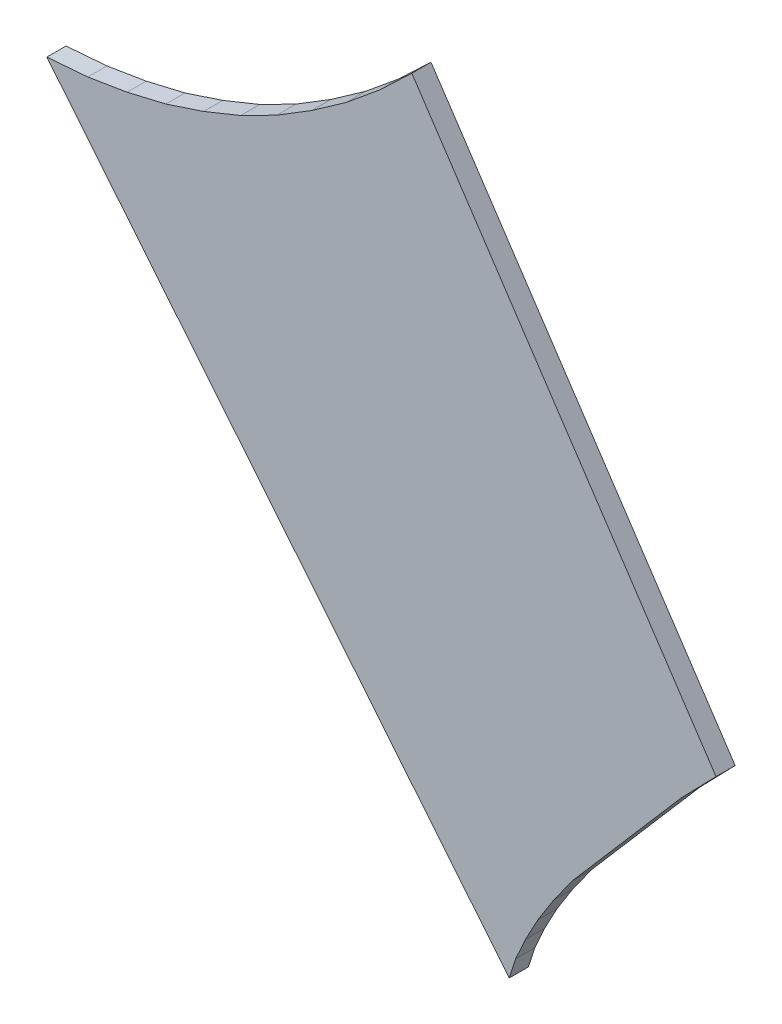
ISO-10303-21;
HEADER;
FILE_DESCRIPTION(('STEP AP214'),'2;1');
FILE_NAME('part.step','',(''),(''),'','','');
FILE_SCHEMA(('AUTOMOTIVE_DESIGN { 1 0 10303 214 1 1 1 1 }'));
ENDSEC;
DATA;
#1=APPLICATION_CONTEXT('core data for automotive mechanical design processes');
#2=APPLICATION_PROTOCOL_DEFINITION('international standard','automotive_design',2000,#1);
#3=PRODUCT_CONTEXT('',#1,'mechanical');
#4=PRODUCT('Part','Part','',(#3));
#5=PRODUCT_RELATED_PRODUCT_CATEGORY('part','',(#4));
#6=PRODUCT_DEFINITION_FORMATION('','',#4);
#7=PRODUCT_DEFINITION_CONTEXT('part definition',#1,'design');
#8=PRODUCT_DEFINITION('design','',#6,#7);
#9=PRODUCT_DEFINITION_SHAPE('','',#8);
#10=(LENGTH_UNIT() NAMED_UNIT(*) SI_UNIT(.MILLI.,.METRE.));
#11=(NAMED_UNIT(*) PLANE_ANGLE_UNIT() SI_UNIT($,.RADIAN.));
#12=(NAMED_UNIT(*) SI_UNIT($,.STERADIAN.) SOLID_ANGLE_UNIT());
#13=UNCERTAINTY_MEASURE_WITH_UNIT(LENGTH_MEASURE(1.E-05),#10,'distance_accuracy_value','');
#14=(GEOMETRIC_REPRESENTATION_CONTEXT(3) GLOBAL_UNCERTAINTY_ASSIGNED_CONTEXT((#13)) GLOBAL_UNIT_ASSIGNED_CONTEXT((#10,
#11,#12)) REPRESENTATION_CONTEXT('',''));
#15=CARTESIAN_POINT('',(0.,0.,0.));
#16=DIRECTION('',(0.,0.,1.));
#17=DIRECTION('',(1.,0.,0.));
#18=AXIS2_PLACEMENT_3D('',#15,#16,#17);
#19=CARTESIAN_POINT('',(80.5439987182617,81.3219985961914,0.));
#20=DIRECTION('',(0.688759153419594,-0.724990226541519,0.));
#21=DIRECTION('',(-0.724990226541519,-0.688759153419594,0.));
#22=AXIS2_PLACEMENT_3D('',#19,#20,#21);
#23=PLANE('',#22);
#24=DIRECTION('',(-0.724990226541519,-0.688759153419594,0.));
#25=VECTOR('',#24,1.);
#26=CARTESIAN_POINT('',(80.5439987182617,81.3219985961914,0.03556));
#27=LINE('',#26,#25);
#28=CARTESIAN_POINT('',(80.5439987182617,81.3219985961914,0.03556));
#29=VERTEX_POINT('',#28);
#30=CARTESIAN_POINT('',(80.484001159668,81.2649993896484,0.03556));
#31=VERTEX_POINT('',#30);
#32=EDGE_CURVE('E11',#29,#31,#27,.T.);
#33=ORIENTED_EDGE('',*,*,#32,.F.);
#34=DIRECTION('',(0.,0.,1.));
#35=VECTOR('',#34,1.);
#36=CARTESIAN_POINT('',(80.5439987182617,81.3219985961914,0.));
#37=LINE('',#36,#35);
#38=CARTESIAN_POINT('',(80.5439987182617,81.3219985961914,0.));
#39=VERTEX_POINT('',#38);
#40=EDGE_CURVE('E24',#39,#29,#37,.T.);
#41=ORIENTED_EDGE('',*,*,#40,.F.);
#42=DIRECTION('',(-0.724990226541519,-0.688759153419594,0.));
#43=VECTOR('',#42,1.);
#44=CARTESIAN_POINT('',(80.5439987182617,81.3219985961914,0.));
#45=LINE('',#44,#43);
#46=CARTESIAN_POINT('',(80.484001159668,81.2649993896484,0.));
#47=VERTEX_POINT('',#46);
#48=EDGE_CURVE('E166',#39,#47,#45,.T.);
#49=ORIENTED_EDGE('',*,*,#48,.T.);
#50=DIRECTION('',(0.,0.,1.));
#51=VECTOR('',#50,1.);
#52=CARTESIAN_POINT('',(80.484001159668,81.2649993896484,0.));
#53=LINE('',#52,#51);
#54=EDGE_CURVE('E37',#47,#31,#53,.T.);
#55=ORIENTED_EDGE('',*,*,#54,.T.);
#56=EDGE_LOOP('',(#33,#41,#49,#55));
#57=FACE_BOUND('',#56,.T.);
#58=ADVANCED_FACE('F17',(#57),#23,.F.);
#59=CARTESIAN_POINT('',(80.484001159668,81.2649993896484,0.));
#60=DIRECTION('',(0.635264139986217,-0.772294938768585,0.));
#61=DIRECTION('',(-0.772294938768585,-0.635264139986217,0.));
#62=AXIS2_PLACEMENT_3D('',#59,#60,#61);
#63=PLANE('',#62);
#64=DIRECTION('',(-0.772294938768585,-0.635264139986217,0.));
#65=VECTOR('',#64,1.);
#66=CARTESIAN_POINT('',(80.484001159668,81.2649993896484,0.03556));
#67=LINE('',#66,#65);
#68=CARTESIAN_POINT('',(80.4219970703125,81.213996887207,0.03556));
#69=VERTEX_POINT('',#68);
#70=EDGE_CURVE('E294',#31,#69,#67,.T.);
#71=ORIENTED_EDGE('',*,*,#70,.F.);
#72=ORIENTED_EDGE('',*,*,#54,.F.);
#73=DIRECTION('',(-0.772294938768585,-0.635264139986217,0.));
#74=VECTOR('',#73,1.);
#75=CARTESIAN_POINT('',(80.484001159668,81.2649993896484,0.));
#76=LINE('',#75,#74);
#77=CARTESIAN_POINT('',(80.4219970703125,81.213996887207,0.));
#78=VERTEX_POINT('',#77);
#79=EDGE_CURVE('E291',#47,#78,#76,.T.);
#80=ORIENTED_EDGE('',*,*,#79,.T.);
#81=DIRECTION('',(0.,0.,1.));
#82=VECTOR('',#81,1.);
#83=CARTESIAN_POINT('',(80.4219970703125,81.213996887207,0.));
#84=LINE('',#83,#82);
#85=EDGE_CURVE('E289',#78,#69,#84,.T.);
#86=ORIENTED_EDGE('',*,*,#85,.T.);
#87=EDGE_LOOP('',(#71,#72,#80,#86));
#88=FACE_BOUND('',#87,.T.);
#89=ADVANCED_FACE('F302',(#88),#63,.F.);
#90=CARTESIAN_POINT('',(80.4219970703125,81.213996887207,0.));
#91=DIRECTION('',(0.575188988071486,-0.818020554754769,0.));
#92=DIRECTION('',(-0.818020554754769,-0.575188988071486,0.));
#93=AXIS2_PLACEMENT_3D('',#90,#91,#92);
#94=PLANE('',#93);
#95=DIRECTION('',(-0.818020554754769,-0.575188988071486,0.));
#96=VECTOR('',#95,1.);
#97=CARTESIAN_POINT('',(80.4219970703125,81.213996887207,0.03556));
#98=LINE('',#97,#96);
#99=CARTESIAN_POINT('',(80.3580017089844,81.1689987182617,0.03556));
#100=VERTEX_POINT('',#99);
#101=EDGE_CURVE('E286',#69,#100,#98,.T.);
#102=ORIENTED_EDGE('',*,*,#101,.F.);
#103=ORIENTED_EDGE('',*,*,#85,.F.);
#104=DIRECTION('',(-0.818020554754769,-0.575188988071486,0.));
#105=VECTOR('',#104,1.);
#106=CARTESIAN_POINT('',(80.4219970703125,81.213996887207,0.));
#107=LINE('',#106,#105);
#108=CARTESIAN_POINT('',(80.3580017089844,81.1689987182617,0.));
#109=VERTEX_POINT('',#108);
#110=EDGE_CURVE('E283',#78,#109,#107,.T.);
#111=ORIENTED_EDGE('',*,*,#110,.T.);
#112=DIRECTION('',(0.,0.,1.));
#113=VECTOR('',#112,1.);
#114=CARTESIAN_POINT('',(80.3580017089844,81.1689987182617,0.));
#115=LINE('',#114,#113);
#116=EDGE_CURVE('E281',#109,#100,#115,.T.);
#117=ORIENTED_EDGE('',*,*,#116,.T.);
#118=EDGE_LOOP('',(#102,#103,#111,#117));
#119=FACE_BOUND('',#118,.T.);
#120=ADVANCED_FACE('F308',(#119),#94,.F.);
#121=CARTESIAN_POINT('',(80.3580017089844,81.1689987182617,0.));
#122=DIRECTION('',(0.524091848469024,-0.851661748799558,0.));
#123=DIRECTION('',(-0.851661748799558,-0.524091848469024,0.));
#124=AXIS2_PLACEMENT_3D('',#121,#122,#123);
#125=PLANE('',#124);
#126=DIRECTION('',(-0.851661748799558,-0.524091848469024,0.));
#127=VECTOR('',#126,1.);
#128=CARTESIAN_POINT('',(80.3580017089844,81.1689987182617,0.03556));
#129=LINE('',#128,#127);
#130=CARTESIAN_POINT('',(80.2929992675781,81.1289978027344,0.03556));
#131=VERTEX_POINT('',#130);
#132=EDGE_CURVE('E278',#100,#131,#129,.T.);
#133=ORIENTED_EDGE('',*,*,#132,.F.);
#134=ORIENTED_EDGE('',*,*,#116,.F.);
#135=DIRECTION('',(-0.851661748799558,-0.524091848469024,0.));
#136=VECTOR('',#135,1.);
#137=CARTESIAN_POINT('',(80.3580017089844,81.1689987182617,0.));
#138=LINE('',#137,#136);
#139=CARTESIAN_POINT('',(80.2929992675781,81.1289978027344,0.));
#140=VERTEX_POINT('',#139);
#141=EDGE_CURVE('E275',#109,#140,#138,.T.);
#142=ORIENTED_EDGE('',*,*,#141,.T.);
#143=DIRECTION('',(0.,0.,1.));
#144=VECTOR('',#143,1.);
#145=CARTESIAN_POINT('',(80.2929992675781,81.1289978027344,0.));
#146=LINE('',#145,#144);
#147=EDGE_CURVE('E273',#140,#131,#146,.T.);
#148=ORIENTED_EDGE('',*,*,#147,.T.);
#149=EDGE_LOOP('',(#133,#134,#142,#148));
#150=FACE_BOUND('',#149,.T.);
#151=ADVANCED_FACE('F310',(#150),#125,.F.);
#152=CARTESIAN_POINT('',(80.2929992675781,81.1289978027344,0.));
#153=DIRECTION('',(0.452486161275372,-0.891771424667935,0.));
#154=DIRECTION('',(-0.891771424667935,-0.452486161275372,0.));
#155=AXIS2_PLACEMENT_3D('',#152,#153,#154);
#156=PLANE('',#155);
#157=DIRECTION('',(-0.891771424667935,-0.452486161275372,0.));
#158=VECTOR('',#157,1.);
#159=CARTESIAN_POINT('',(80.2929992675781,81.1289978027344,0.03556));
#160=LINE('',#159,#158);
#161=CARTESIAN_POINT('',(80.2259979248047,81.0950012207031,0.03556));
#162=VERTEX_POINT('',#161);
#163=EDGE_CURVE('E270',#131,#162,#160,.T.);
#164=ORIENTED_EDGE('',*,*,#163,.F.);
#165=ORIENTED_EDGE('',*,*,#147,.F.);
#166=DIRECTION('',(-0.891771424667935,-0.452486161275372,0.));
#167=VECTOR('',#166,1.);
#168=CARTESIAN_POINT('',(80.2929992675781,81.1289978027344,0.));
#169=LINE('',#168,#167);
#170=CARTESIAN_POINT('',(80.2259979248047,81.0950012207031,0.));
#171=VERTEX_POINT('',#170);
#172=EDGE_CURVE('E267',#140,#171,#169,.T.);
#173=ORIENTED_EDGE('',*,*,#172,.T.);
#174=DIRECTION('',(0.,0.,1.));
#175=VECTOR('',#174,1.);
#176=CARTESIAN_POINT('',(80.2259979248047,81.0950012207031,0.));
#177=LINE('',#176,#175);
#178=EDGE_CURVE('E265',#171,#162,#177,.T.);
#179=ORIENTED_EDGE('',*,*,#178,.T.);
#180=EDGE_LOOP('',(#164,#165,#173,#179));
#181=FACE_BOUND('',#180,.T.);
#182=ADVANCED_FACE('F315',(#181),#156,.F.);
#183=CARTESIAN_POINT('',(80.2259979248047,81.0950012207031,0.));
#184=DIRECTION('',(0.376014256166483,-0.926613878138875,0.));
#185=DIRECTION('',(-0.926613878138875,-0.376014256166483,0.));
#186=AXIS2_PLACEMENT_3D('',#183,#184,#185);
#187=PLANE('',#186);
#188=DIRECTION('',(-0.926613878138875,-0.376014256166483,0.));
#189=VECTOR('',#188,1.);
#190=CARTESIAN_POINT('',(80.2259979248047,81.0950012207031,0.03556));
#191=LINE('',#190,#189);
#192=CARTESIAN_POINT('',(80.1569976806641,81.0670013427734,0.03556));
#193=VERTEX_POINT('',#192);
#194=EDGE_CURVE('E262',#162,#193,#191,.T.);
#195=ORIENTED_EDGE('',*,*,#194,.F.);
#196=ORIENTED_EDGE('',*,*,#178,.F.);
#197=DIRECTION('',(-0.926613878138875,-0.376014256166483,0.));
#198=VECTOR('',#197,1.);
#199=CARTESIAN_POINT('',(80.2259979248047,81.0950012207031,0.));
#200=LINE('',#199,#198);
#201=CARTESIAN_POINT('',(80.1569976806641,81.0670013427734,0.));
#202=VERTEX_POINT('',#201);
#203=EDGE_CURVE('E259',#171,#202,#200,.T.);
#204=ORIENTED_EDGE('',*,*,#203,.T.);
#205=DIRECTION('',(0.,0.,1.));
#206=VECTOR('',#205,1.);
#207=CARTESIAN_POINT('',(80.1569976806641,81.0670013427734,0.));
#208=LINE('',#207,#206);
#209=EDGE_CURVE('E257',#202,#193,#208,.T.);
#210=ORIENTED_EDGE('',*,*,#209,.T.);
#211=EDGE_LOOP('',(#195,#196,#204,#210));
#212=FACE_BOUND('',#211,.T.);
#213=ADVANCED_FACE('F318',(#212),#187,.F.);
#214=CARTESIAN_POINT('',(80.1569976806641,81.0670013427734,0.));
#215=DIRECTION('',(0.312186665619563,-0.950020781777609,0.));
#216=DIRECTION('',(-0.950020781777609,-0.312186665619563,0.));
#217=AXIS2_PLACEMENT_3D('',#214,#215,#216);
#218=PLANE('',#217);
#219=DIRECTION('',(-0.950020781777609,-0.312186665619563,0.));
#220=VECTOR('',#219,1.);
#221=CARTESIAN_POINT('',(80.1569976806641,81.0670013427734,0.03556));
#222=LINE('',#221,#220);
#223=CARTESIAN_POINT('',(80.0869979858398,81.0439987182617,0.03556));
#224=VERTEX_POINT('',#223);
#225=EDGE_CURVE('E254',#193,#224,#222,.T.);
#226=ORIENTED_EDGE('',*,*,#225,.F.);
#227=ORIENTED_EDGE('',*,*,#209,.F.);
#228=DIRECTION('',(-0.950020781777609,-0.312186665619563,0.));
#229=VECTOR('',#228,1.);
#230=CARTESIAN_POINT('',(80.1569976806641,81.0670013427734,0.));
#231=LINE('',#230,#229);
#232=CARTESIAN_POINT('',(80.0869979858398,81.0439987182617,0.));
#233=VERTEX_POINT('',#232);
#234=EDGE_CURVE('E251',#202,#233,#231,.T.);
#235=ORIENTED_EDGE('',*,*,#234,.T.);
#236=DIRECTION('',(0.,0.,1.));
#237=VECTOR('',#236,1.);
#238=CARTESIAN_POINT('',(80.0869979858398,81.0439987182617,0.));
#239=LINE('',#238,#237);
#240=EDGE_CURVE('E249',#233,#224,#239,.T.);
#241=ORIENTED_EDGE('',*,*,#240,.T.);
#242=EDGE_LOOP('',(#226,#227,#235,#241));
#243=FACE_BOUND('',#242,.T.);
#244=ADVANCED_FACE('F323',(#243),#218,.F.);
#245=CARTESIAN_POINT('',(80.0869979858398,81.0439987182617,0.));
#246=DIRECTION('',(0.229775046175605,-0.973243766049903,0.));
#247=DIRECTION('',(-0.973243766049903,-0.229775046175605,0.));
#248=AXIS2_PLACEMENT_3D('',#245,#246,#247);
#249=PLANE('',#248);
#250=DIRECTION('',(-0.973243766049903,-0.229775046175605,0.));
#251=VECTOR('',#250,1.);
#252=CARTESIAN_POINT('',(80.0869979858398,81.0439987182617,0.03556));
#253=LINE('',#252,#251);
#254=CARTESIAN_POINT('',(80.0149993896484,81.0270004272461,0.03556));
#255=VERTEX_POINT('',#254);
#256=EDGE_CURVE('E246',#224,#255,#253,.T.);
#257=ORIENTED_EDGE('',*,*,#256,.F.);
#258=ORIENTED_EDGE('',*,*,#240,.F.);
#259=DIRECTION('',(-0.973243766049903,-0.229775046175605,0.));
#260=VECTOR('',#259,1.);
#261=CARTESIAN_POINT('',(80.0869979858398,81.0439987182617,0.));
#262=LINE('',#261,#260);
#263=CARTESIAN_POINT('',(80.0149993896484,81.0270004272461,0.));
#264=VERTEX_POINT('',#263);
#265=EDGE_CURVE('E243',#233,#264,#262,.T.);
#266=ORIENTED_EDGE('',*,*,#265,.T.);
#267=DIRECTION('',(0.,0.,1.));
#268=VECTOR('',#267,1.);
#269=CARTESIAN_POINT('',(80.0149993896484,81.0270004272461,0.));
#270=LINE('',#269,#268);
#271=EDGE_CURVE('E241',#264,#255,#270,.T.);
#272=ORIENTED_EDGE('',*,*,#271,.T.);
#273=EDGE_LOOP('',(#257,#258,#266,#272));
#274=FACE_BOUND('',#273,.T.);
#275=ADVANCED_FACE('F326',(#274),#249,.F.);
#276=CARTESIAN_POINT('',(80.0149993896484,81.0270004272461,0.));
#277=DIRECTION('',(0.162224482780174,-0.98675387872899,0.));
#278=DIRECTION('',(-0.98675387872899,-0.162224482780174,0.));
#279=AXIS2_PLACEMENT_3D('',#276,#277,#278);
#280=PLANE('',#279);
#281=DIRECTION('',(-0.98675387872899,-0.162224482780174,0.));
#282=VECTOR('',#281,1.);
#283=CARTESIAN_POINT('',(80.0149993896484,81.0270004272461,0.03556));
#284=LINE('',#283,#282);
#285=CARTESIAN_POINT('',(79.9420013427734,81.0149993896484,0.03556));
#286=VERTEX_POINT('',#285);
#287=EDGE_CURVE('E238',#255,#286,#284,.T.);
#288=ORIENTED_EDGE('',*,*,#287,.F.);
#289=ORIENTED_EDGE('',*,*,#271,.F.);
#290=DIRECTION('',(-0.98675387872899,-0.162224482780174,0.));
#291=VECTOR('',#290,1.);
#292=CARTESIAN_POINT('',(80.0149993896484,81.0270004272461,0.));
#293=LINE('',#292,#291);
#294=CARTESIAN_POINT('',(79.9420013427734,81.0149993896484,0.));
#295=VERTEX_POINT('',#294);
#296=EDGE_CURVE('E235',#264,#295,#293,.T.);
#297=ORIENTED_EDGE('',*,*,#296,.T.);
#298=DIRECTION('',(0.,0.,1.));
#299=VECTOR('',#298,1.);
#300=CARTESIAN_POINT('',(79.9420013427734,81.0149993896484,0.));
#301=LINE('',#300,#299);
#302=EDGE_CURVE('E233',#295,#286,#301,.T.);
#303=ORIENTED_EDGE('',*,*,#302,.T.);
#304=EDGE_LOOP('',(#288,#289,#297,#303));
#305=FACE_BOUND('',#304,.T.);
#306=ADVANCED_FACE('F331',(#305),#280,.F.);
#307=CARTESIAN_POINT('',(79.9420013427734,81.0149993896484,0.));
#308=DIRECTION('',(0.0786553771485181,-0.996901866607553,0.));
#309=DIRECTION('',(-0.996901866607553,-0.0786553771485181,0.));
#310=AXIS2_PLACEMENT_3D('',#307,#308,#309);
#311=PLANE('',#310);
#312=DIRECTION('',(-0.996901866607553,-0.0786553771485181,0.));
#313=VECTOR('',#312,1.);
#314=CARTESIAN_POINT('',(79.9420013427734,81.0149993896484,0.03556));
#315=LINE('',#314,#313);
#316=CARTESIAN_POINT('',(79.8659973144531,81.0090026855469,0.03556));
#317=VERTEX_POINT('',#316);
#318=EDGE_CURVE('E230',#286,#317,#315,.T.);
#319=ORIENTED_EDGE('',*,*,#318,.F.);
#320=ORIENTED_EDGE('',*,*,#302,.F.);
#321=DIRECTION('',(-0.996901866607553,-0.0786553771485181,0.));
#322=VECTOR('',#321,1.);
#323=CARTESIAN_POINT('',(79.9420013427734,81.0149993896484,0.));
#324=LINE('',#323,#322);
#325=CARTESIAN_POINT('',(79.8659973144531,81.0090026855469,0.));
#326=VERTEX_POINT('',#325);
#327=EDGE_CURVE('E227',#295,#326,#324,.T.);
#328=ORIENTED_EDGE('',*,*,#327,.T.);
#329=DIRECTION('',(0.,0.,1.));
#330=VECTOR('',#329,1.);
#331=CARTESIAN_POINT('',(79.8659973144531,81.0090026855469,0.));
#332=LINE('',#331,#330);
#333=EDGE_CURVE('E225',#326,#317,#332,.T.);
#334=ORIENTED_EDGE('',*,*,#333,.T.);
#335=EDGE_LOOP('',(#319,#320,#328,#334));
#336=FACE_BOUND('',#335,.T.);
#337=ADVANCED_FACE('F334',(#336),#311,.F.);
#338=CARTESIAN_POINT('',(79.8659973144531,81.0090026855469,0.));
#339=DIRECTION('',(0.774580378765425,0.632475483186195,0.));
#340=DIRECTION('',(0.632475483186195,-0.774580378765425,0.));
#341=AXIS2_PLACEMENT_3D('',#338,#339,#340);
#342=PLANE('',#341);
#343=DIRECTION('',(0.632475483186195,-0.774580378765425,0.));
#344=VECTOR('',#343,1.);
#345=CARTESIAN_POINT('',(79.8659973144531,81.0090026855469,0.03556));
#346=LINE('',#345,#344);
#347=CARTESIAN_POINT('',(80.7249984741211,79.9570007324219,0.03556));
#348=VERTEX_POINT('',#347);
#349=EDGE_CURVE('E222',#317,#348,#346,.T.);
#350=ORIENTED_EDGE('',*,*,#349,.F.);
#351=ORIENTED_EDGE('',*,*,#333,.F.);
#352=DIRECTION('',(0.632475483186195,-0.774580378765425,0.));
#353=VECTOR('',#352,1.);
#354=CARTESIAN_POINT('',(79.8659973144531,81.0090026855469,0.));
#355=LINE('',#354,#353);
#356=CARTESIAN_POINT('',(80.7249984741211,79.9570007324219,0.));
#357=VERTEX_POINT('',#356);
#358=EDGE_CURVE('E219',#326,#357,#355,.T.);
#359=ORIENTED_EDGE('',*,*,#358,.T.);
#360=DIRECTION('',(0.,0.,1.));
#361=VECTOR('',#360,1.);
#362=CARTESIAN_POINT('',(80.7249984741211,79.9570007324219,0.));
#363=LINE('',#362,#361);
#364=EDGE_CURVE('E217',#357,#348,#363,.T.);
#365=ORIENTED_EDGE('',*,*,#364,.T.);
#366=EDGE_LOOP('',(#350,#351,#359,#365));
#367=FACE_BOUND('',#366,.T.);
#368=ADVANCED_FACE('F339',(#367),#342,.F.);
#369=CARTESIAN_POINT('',(80.7249984741211,79.9570007324219,0.));
#370=DIRECTION('',(-0.951221263393282,0.308509494292296,0.));
#371=DIRECTION('',(0.308509494292296,0.951221263393282,0.));
#372=AXIS2_PLACEMENT_3D('',#369,#370,#371);
#373=PLANE('',#372);
#374=DIRECTION('',(0.308509494292296,0.951221263393282,0.));
#375=VECTOR('',#374,1.);
#376=CARTESIAN_POINT('',(80.7249984741211,79.9570007324219,0.03556));
#377=LINE('',#376,#375);
#378=CARTESIAN_POINT('',(80.7369995117188,79.9940032958984,0.03556));
#379=VERTEX_POINT('',#378);
#380=EDGE_CURVE('E214',#348,#379,#377,.T.);
#381=ORIENTED_EDGE('',*,*,#380,.F.);
#382=ORIENTED_EDGE('',*,*,#364,.F.);
#383=DIRECTION('',(0.308509494292296,0.951221263393282,0.));
#384=VECTOR('',#383,1.);
#385=CARTESIAN_POINT('',(80.7249984741211,79.9570007324219,0.));
#386=LINE('',#385,#384);
#387=CARTESIAN_POINT('',(80.7369995117188,79.9940032958984,0.));
#388=VERTEX_POINT('',#387);
#389=EDGE_CURVE('E211',#357,#388,#386,.T.);
#390=ORIENTED_EDGE('',*,*,#389,.T.);
#391=DIRECTION('',(0.,0.,1.));
#392=VECTOR('',#391,1.);
#393=CARTESIAN_POINT('',(80.7369995117188,79.9940032958984,0.));
#394=LINE('',#393,#392);
#395=EDGE_CURVE('E209',#388,#379,#394,.T.);
#396=ORIENTED_EDGE('',*,*,#395,.T.);
#397=EDGE_LOOP('',(#381,#382,#390,#396));
#398=FACE_BOUND('',#397,.T.);
#399=ADVANCED_FACE('F342',(#398),#373,.F.);
#400=CARTESIAN_POINT('',(80.7369995117188,79.9940032958984,0.));
#401=DIRECTION('',(-0.911914995003684,0.410379144069762,0.));
#402=DIRECTION('',(0.410379144069762,0.911914995003684,0.));
#403=AXIS2_PLACEMENT_3D('',#400,#401,#402);
#404=PLANE('',#403);
#405=DIRECTION('',(0.410379144069762,0.911914995003684,0.));
#406=VECTOR('',#405,1.);
#407=CARTESIAN_POINT('',(80.7369995117188,79.9940032958984,0.03556));
#408=LINE('',#407,#406);
#409=CARTESIAN_POINT('',(80.754997253418,80.0339965820312,0.03556));
#410=VERTEX_POINT('',#409);
#411=EDGE_CURVE('E206',#379,#410,#408,.T.);
#412=ORIENTED_EDGE('',*,*,#411,.F.);
#413=ORIENTED_EDGE('',*,*,#395,.F.);
#414=DIRECTION('',(0.410379144069762,0.911914995003684,0.));
#415=VECTOR('',#414,1.);
#416=CARTESIAN_POINT('',(80.7369995117188,79.9940032958984,0.));
#417=LINE('',#416,#415);
#418=CARTESIAN_POINT('',(80.754997253418,80.0339965820312,0.));
#419=VERTEX_POINT('',#418);
#420=EDGE_CURVE('E203',#388,#419,#417,.T.);
#421=ORIENTED_EDGE('',*,*,#420,.T.);
#422=DIRECTION('',(0.,0.,1.));
#423=VECTOR('',#422,1.);
#424=CARTESIAN_POINT('',(80.754997253418,80.0339965820312,0.));
#425=LINE('',#424,#423);
#426=EDGE_CURVE('E201',#419,#410,#425,.T.);
#427=ORIENTED_EDGE('',*,*,#426,.T.);
#428=EDGE_LOOP('',(#412,#413,#421,#427));
#429=FACE_BOUND('',#428,.T.);
#430=ADVANCED_FACE('F347',(#429),#404,.F.);
#431=CARTESIAN_POINT('',(80.754997253418,80.0339965820312,0.));
#432=DIRECTION('',(-0.88179371968826,0.471635278492124,0.));
#433=DIRECTION('',(0.471635278492124,0.88179371968826,0.));
#434=AXIS2_PLACEMENT_3D('',#431,#432,#433);
#435=PLANE('',#434);
#436=DIRECTION('',(0.471635278492124,0.88179371968826,0.));
#437=VECTOR('',#436,1.);
#438=CARTESIAN_POINT('',(80.754997253418,80.0339965820312,0.03556));
#439=LINE('',#438,#437);
#440=CARTESIAN_POINT('',(80.7779998779297,80.0770034790039,0.03556));
#441=VERTEX_POINT('',#440);
#442=EDGE_CURVE('E198',#410,#441,#439,.T.);
#443=ORIENTED_EDGE('',*,*,#442,.F.);
#444=ORIENTED_EDGE('',*,*,#426,.F.);
#445=DIRECTION('',(0.471635278492124,0.88179371968826,0.));
#446=VECTOR('',#445,1.);
#447=CARTESIAN_POINT('',(80.754997253418,80.0339965820312,0.));
#448=LINE('',#447,#446);
#449=CARTESIAN_POINT('',(80.7779998779297,80.0770034790039,0.));
#450=VERTEX_POINT('',#449);
#451=EDGE_CURVE('E195',#419,#450,#448,.T.);
#452=ORIENTED_EDGE('',*,*,#451,.T.);
#453=DIRECTION('',(0.,0.,1.));
#454=VECTOR('',#453,1.);
#455=CARTESIAN_POINT('',(80.7779998779297,80.0770034790039,0.));
#456=LINE('',#455,#454);
#457=EDGE_CURVE('E193',#450,#441,#456,.T.);
#458=ORIENTED_EDGE('',*,*,#457,.T.);
#459=EDGE_LOOP('',(#443,#444,#452,#458));
#460=FACE_BOUND('',#459,.T.);
#461=ADVANCED_FACE('F350',(#460),#435,.F.);
#462=CARTESIAN_POINT('',(80.7779998779297,80.0770034790039,0.));
#463=DIRECTION('',(-0.845918722341603,0.533311836725897,0.));
#464=DIRECTION('',(0.533311836725897,0.845918722341603,0.));
#465=AXIS2_PLACEMENT_3D('',#462,#463,#464);
#466=PLANE('',#465);
#467=DIRECTION('',(0.533311836725897,0.845918722341603,0.));
#468=VECTOR('',#467,1.);
#469=CARTESIAN_POINT('',(80.7779998779297,80.0770034790039,0.03556));
#470=LINE('',#469,#468);
#471=CARTESIAN_POINT('',(80.806999206543,80.1230010986328,0.03556));
#472=VERTEX_POINT('',#471);
#473=EDGE_CURVE('E190',#441,#472,#470,.T.);
#474=ORIENTED_EDGE('',*,*,#473,.F.);
#475=ORIENTED_EDGE('',*,*,#457,.F.);
#476=DIRECTION('',(0.533311836725897,0.845918722341603,0.));
#477=VECTOR('',#476,1.);
#478=CARTESIAN_POINT('',(80.7779998779297,80.0770034790039,0.));
#479=LINE('',#478,#477);
#480=CARTESIAN_POINT('',(80.806999206543,80.1230010986328,0.));
#481=VERTEX_POINT('',#480);
#482=EDGE_CURVE('E187',#450,#481,#479,.T.);
#483=ORIENTED_EDGE('',*,*,#482,.T.);
#484=DIRECTION('',(0.,0.,1.));
#485=VECTOR('',#484,1.);
#486=CARTESIAN_POINT('',(80.806999206543,80.1230010986328,0.));
#487=LINE('',#486,#485);
#488=EDGE_CURVE('E185',#481,#472,#487,.T.);
#489=ORIENTED_EDGE('',*,*,#488,.T.);
#490=EDGE_LOOP('',(#474,#475,#483,#489));
#491=FACE_BOUND('',#490,.T.);
#492=ADVANCED_FACE('F355',(#491),#466,.F.);
#493=CARTESIAN_POINT('',(80.806999206543,80.1230010986328,0.));
#494=DIRECTION('',(-0.811485013692909,0.584373230522942,0.));
#495=DIRECTION('',(0.584373230522942,0.811485013692909,0.));
#496=AXIS2_PLACEMENT_3D('',#493,#494,#495);
#497=PLANE('',#496);
#498=DIRECTION('',(0.584373230522942,0.811485013692909,0.));
#499=VECTOR('',#498,1.);
#500=CARTESIAN_POINT('',(80.806999206543,80.1230010986328,0.03556));
#501=LINE('',#500,#499);
#502=CARTESIAN_POINT('',(80.8430023193359,80.1729965209961,0.03556));
#503=VERTEX_POINT('',#502);
#504=EDGE_CURVE('E182',#472,#503,#501,.T.);
#505=ORIENTED_EDGE('',*,*,#504,.F.);
#506=ORIENTED_EDGE('',*,*,#488,.F.);
#507=DIRECTION('',(0.584373230522942,0.811485013692909,0.));
#508=VECTOR('',#507,1.);
#509=CARTESIAN_POINT('',(80.806999206543,80.1230010986328,0.));
#510=LINE('',#509,#508);
#511=CARTESIAN_POINT('',(80.8430023193359,80.1729965209961,0.));
#512=VERTEX_POINT('',#511);
#513=EDGE_CURVE('E179',#481,#512,#510,.T.);
#514=ORIENTED_EDGE('',*,*,#513,.T.);
#515=DIRECTION('',(0.,0.,1.));
#516=VECTOR('',#515,1.);
#517=CARTESIAN_POINT('',(80.8430023193359,80.1729965209961,0.));
#518=LINE('',#517,#516);
#519=EDGE_CURVE('E177',#512,#503,#518,.T.);
#520=ORIENTED_EDGE('',*,*,#519,.T.);
#521=EDGE_LOOP('',(#505,#506,#514,#520));
#522=FACE_BOUND('',#521,.T.);
#523=ADVANCED_FACE('F358',(#522),#497,.F.);
#524=CARTESIAN_POINT('',(80.8430023193359,80.1729965209961,0.));
#525=DIRECTION('',(-0.757196401907071,0.653187269425075,0.));
#526=DIRECTION('',(0.653187269425075,0.757196401907071,0.));
#527=AXIS2_PLACEMENT_3D('',#524,#525,#526);
#528=PLANE('',#527);
#529=DIRECTION('',(0.653187269425075,0.757196401907071,0.));
#530=VECTOR('',#529,1.);
#531=CARTESIAN_POINT('',(80.8430023193359,80.1729965209961,0.03556));
#532=LINE('',#531,#530);
#533=CARTESIAN_POINT('',(81.0439987182617,80.4059982299805,0.03556));
#534=VERTEX_POINT('',#533);
#535=EDGE_CURVE('E174',#503,#534,#532,.T.);
#536=ORIENTED_EDGE('',*,*,#535,.F.);
#537=ORIENTED_EDGE('',*,*,#519,.F.);
#538=DIRECTION('',(0.653187269425075,0.757196401907071,0.));
#539=VECTOR('',#538,1.);
#540=CARTESIAN_POINT('',(80.8430023193359,80.1729965209961,0.));
#541=LINE('',#540,#539);
#542=CARTESIAN_POINT('',(81.0439987182617,80.4059982299805,0.));
#543=VERTEX_POINT('',#542);
#544=EDGE_CURVE('E172',#512,#543,#541,.T.);
#545=ORIENTED_EDGE('',*,*,#544,.T.);
#546=DIRECTION('',(0.,0.,1.));
#547=VECTOR('',#546,1.);
#548=CARTESIAN_POINT('',(81.0439987182617,80.4059982299805,0.));
#549=LINE('',#548,#547);
#550=EDGE_CURVE('E157',#543,#534,#549,.T.);
#551=ORIENTED_EDGE('',*,*,#550,.T.);
#552=EDGE_LOOP('',(#536,#537,#545,#551));
#553=FACE_BOUND('',#552,.T.);
#554=ADVANCED_FACE('F361',(#553),#528,.F.);
#555=CARTESIAN_POINT('',(81.0439987182617,80.4059982299805,0.));
#556=DIRECTION('',(-0.717732043716162,0.696319404743988,0.));
#557=DIRECTION('',(0.696319404743988,0.717732043716162,0.));
#558=AXIS2_PLACEMENT_3D('',#555,#556,#557);
#559=PLANE('',#558);
#560=DIRECTION('',(0.696319404743988,0.717732043716162,0.));
#561=VECTOR('',#560,1.);
#562=CARTESIAN_POINT('',(81.0439987182617,80.4059982299805,0.03556));
#563=LINE('',#562,#561);
#564=CARTESIAN_POINT('',(81.109001159668,80.4729995727539,0.03556));
#565=VERTEX_POINT('',#564);
#566=EDGE_CURVE('E161',#534,#565,#563,.T.);
#567=ORIENTED_EDGE('',*,*,#566,.F.);
#568=ORIENTED_EDGE('',*,*,#550,.F.);
#569=DIRECTION('',(0.696319404743988,0.717732043716162,0.));
#570=VECTOR('',#569,1.);
#571=CARTESIAN_POINT('',(81.0439987182617,80.4059982299805,0.));
#572=LINE('',#571,#570);
#573=CARTESIAN_POINT('',(81.109001159668,80.4729995727539,0.));
#574=VERTEX_POINT('',#573);
#575=EDGE_CURVE('E153',#543,#574,#572,.T.);
#576=ORIENTED_EDGE('',*,*,#575,.T.);
#577=DIRECTION('',(0.,0.,1.));
#578=VECTOR('',#577,1.);
#579=CARTESIAN_POINT('',(81.109001159668,80.4729995727539,0.));
#580=LINE('',#579,#578);
#581=EDGE_CURVE('E143',#574,#565,#580,.T.);
#582=ORIENTED_EDGE('',*,*,#581,.T.);
#583=EDGE_LOOP('',(#567,#568,#576,#582));
#584=FACE_BOUND('',#583,.T.);
#585=ADVANCED_FACE('F156',(#584),#559,.F.);
#586=CARTESIAN_POINT('',(81.109001159668,80.4729995727539,0.));
#587=DIRECTION('',(-0.832501189366734,-0.554023257366488,0.));
#588=DIRECTION('',(-0.554023257366488,0.832501189366734,0.));
#589=AXIS2_PLACEMENT_3D('',#586,#587,#588);
#590=PLANE('',#589);
#591=DIRECTION('',(-0.554023257366488,0.832501189366734,0.));
#592=VECTOR('',#591,1.);
#593=CARTESIAN_POINT('',(81.109001159668,80.4729995727539,0.03556));
#594=LINE('',#593,#592);
#595=EDGE_CURVE('E149',#565,#29,#594,.T.);
#596=ORIENTED_EDGE('',*,*,#595,.F.);
#597=ORIENTED_EDGE('',*,*,#581,.F.);
#598=DIRECTION('',(-0.554023257366488,0.832501189366734,0.));
#599=VECTOR('',#598,1.);
#600=CARTESIAN_POINT('',(81.109001159668,80.4729995727539,0.));
#601=LINE('',#600,#599);
#602=EDGE_CURVE('E147',#574,#39,#601,.T.);
#603=ORIENTED_EDGE('',*,*,#602,.T.);
#604=ORIENTED_EDGE('',*,*,#40,.T.);
#605=EDGE_LOOP('',(#596,#597,#603,#604));
#606=FACE_BOUND('',#605,.T.);
#607=ADVANCED_FACE('F145',(#606),#590,.F.);
#608=CARTESIAN_POINT('',(80.5439987182617,81.3219985961914,0.));
#609=DIRECTION('',(0.,0.,1.));
#610=DIRECTION('',(1.,0.,0.));
#611=AXIS2_PLACEMENT_3D('',#608,#609,#610);
#612=PLANE('',#611);
#613=ORIENTED_EDGE('',*,*,#602,.F.);
#614=ORIENTED_EDGE('',*,*,#575,.F.);
#615=ORIENTED_EDGE('',*,*,#544,.F.);
#616=ORIENTED_EDGE('',*,*,#513,.F.);
#617=ORIENTED_EDGE('',*,*,#482,.F.);
#618=ORIENTED_EDGE('',*,*,#451,.F.);
#619=ORIENTED_EDGE('',*,*,#420,.F.);
#620=ORIENTED_EDGE('',*,*,#389,.F.);
#621=ORIENTED_EDGE('',*,*,#358,.F.);
#622=ORIENTED_EDGE('',*,*,#327,.F.);
#623=ORIENTED_EDGE('',*,*,#296,.F.);
#624=ORIENTED_EDGE('',*,*,#265,.F.);
#625=ORIENTED_EDGE('',*,*,#234,.F.);
#626=ORIENTED_EDGE('',*,*,#203,.F.);
#627=ORIENTED_EDGE('',*,*,#172,.F.);
#628=ORIENTED_EDGE('',*,*,#141,.F.);
#629=ORIENTED_EDGE('',*,*,#110,.F.);
#630=ORIENTED_EDGE('',*,*,#79,.F.);
#631=ORIENTED_EDGE('',*,*,#48,.F.);
#632=EDGE_LOOP('',(#613,#614,#615,#616,#617,#618,#619,#620,#621,#622,#623,#624,#625,#626,#627,
#628,#629,#630,#631));
#633=FACE_BOUND('',#632,.T.);
#634=ADVANCED_FACE('F164',(#633),#612,.F.);
#635=CARTESIAN_POINT('',(80.5439987182617,81.3219985961914,0.03556));
#636=DIRECTION('',(0.,0.,1.));
#637=DIRECTION('',(1.,0.,0.));
#638=AXIS2_PLACEMENT_3D('',#635,#636,#637);
#639=PLANE('',#638);
#640=ORIENTED_EDGE('',*,*,#32,.T.);
#641=ORIENTED_EDGE('',*,*,#70,.T.);
#642=ORIENTED_EDGE('',*,*,#101,.T.);
#643=ORIENTED_EDGE('',*,*,#132,.T.);
#644=ORIENTED_EDGE('',*,*,#163,.T.);
#645=ORIENTED_EDGE('',*,*,#194,.T.);
#646=ORIENTED_EDGE('',*,*,#225,.T.);
#647=ORIENTED_EDGE('',*,*,#256,.T.);
#648=ORIENTED_EDGE('',*,*,#287,.T.);
#649=ORIENTED_EDGE('',*,*,#318,.T.);
#650=ORIENTED_EDGE('',*,*,#349,.T.);
#651=ORIENTED_EDGE('',*,*,#380,.T.);
#652=ORIENTED_EDGE('',*,*,#411,.T.);
#653=ORIENTED_EDGE('',*,*,#442,.T.);
#654=ORIENTED_EDGE('',*,*,#473,.T.);
#655=ORIENTED_EDGE('',*,*,#504,.T.);
#656=ORIENTED_EDGE('',*,*,#535,.T.);
#657=ORIENTED_EDGE('',*,*,#566,.T.);
#658=ORIENTED_EDGE('',*,*,#595,.T.);
#659=EDGE_LOOP('',(#640,#641,#642,#643,#644,#645,#646,#647,#648,#649,#650,#651,#652,#653,#654,
#655,#656,#657,#658));
#660=FACE_BOUND('',#659,.T.);
#661=ADVANCED_FACE('F305',(#660),#639,.T.);
#662=CLOSED_SHELL('',(#58,#89,#120,#151,#182,#213,#244,#275,#306,#337,#368,#399,#430,#461,#492,
#523,#554,#585,#607,#634,#661));
#663=MANIFOLD_SOLID_BREP('B1',#662);
#664=ADVANCED_BREP_SHAPE_REPRESENTATION('',(#18,#663),#14);
#665=SHAPE_DEFINITION_REPRESENTATION(#9,#664);
ENDSEC;
END-ISO-10303-21;
